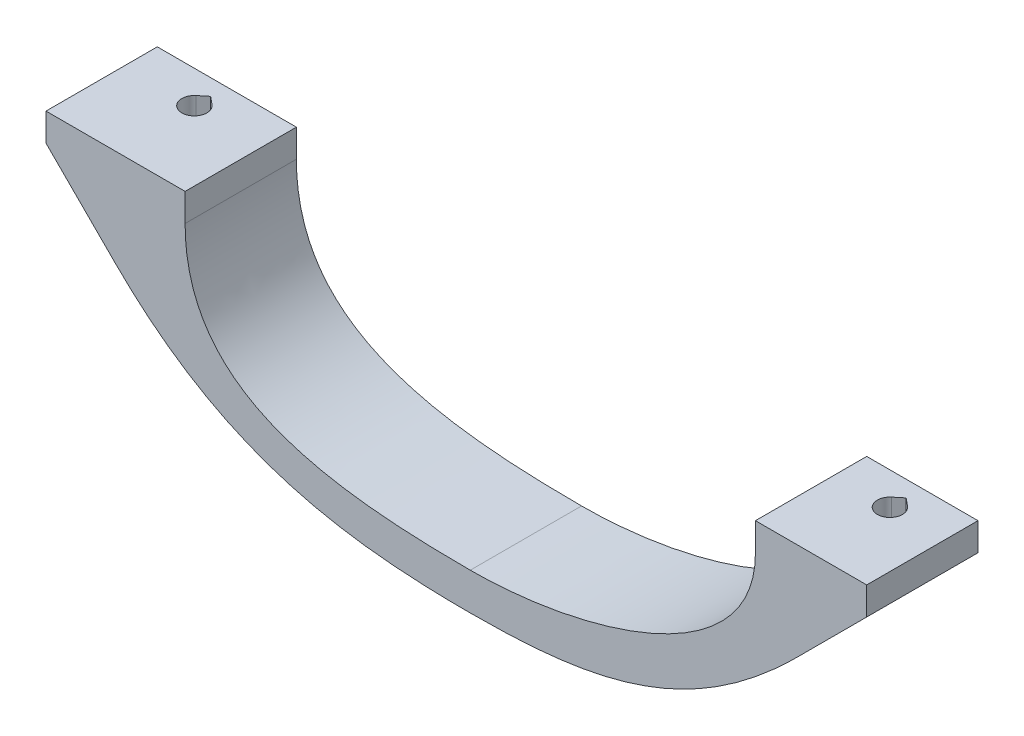
ISO-10303-21;
HEADER;
FILE_DESCRIPTION(('STEP AP214'),'2;1');
FILE_NAME('part.step','',(''),(''),'','','');
FILE_SCHEMA(('AUTOMOTIVE_DESIGN { 1 0 10303 214 1 1 1 1 }'));
ENDSEC;
DATA;
#1=APPLICATION_CONTEXT('core data for automotive mechanical design processes');
#2=APPLICATION_PROTOCOL_DEFINITION('international standard','automotive_design',2000,#1);
#3=PRODUCT_CONTEXT('',#1,'mechanical');
#4=PRODUCT('Part','Part','',(#3));
#5=PRODUCT_RELATED_PRODUCT_CATEGORY('part','',(#4));
#6=PRODUCT_DEFINITION_FORMATION('','',#4);
#7=PRODUCT_DEFINITION_CONTEXT('part definition',#1,'design');
#8=PRODUCT_DEFINITION('design','',#6,#7);
#9=PRODUCT_DEFINITION_SHAPE('','',#8);
#10=(LENGTH_UNIT() NAMED_UNIT(*) SI_UNIT(.MILLI.,.METRE.));
#11=(NAMED_UNIT(*) PLANE_ANGLE_UNIT() SI_UNIT($,.RADIAN.));
#12=(NAMED_UNIT(*) SI_UNIT($,.STERADIAN.) SOLID_ANGLE_UNIT());
#13=UNCERTAINTY_MEASURE_WITH_UNIT(LENGTH_MEASURE(1.E-05),#10,'distance_accuracy_value','');
#14=(GEOMETRIC_REPRESENTATION_CONTEXT(3) GLOBAL_UNCERTAINTY_ASSIGNED_CONTEXT((#13)) GLOBAL_UNIT_ASSIGNED_CONTEXT((#10,
#11,#12)) REPRESENTATION_CONTEXT('',''));
#15=CARTESIAN_POINT('',(0.,0.,0.));
#16=DIRECTION('',(0.,0.,1.));
#17=DIRECTION('',(1.,0.,0.));
#18=AXIS2_PLACEMENT_3D('',#15,#16,#17);
#19=CARTESIAN_POINT('',(82.5,-63.9999999999999,-8.5));
#20=DIRECTION('',(0.,1.,0.));
#21=DIRECTION('',(0.,0.,1.));
#22=AXIS2_PLACEMENT_3D('',#19,#20,#21);
#23=CYLINDRICAL_SURFACE('',#22,1.35000000000001);
#24=DIRECTION('',(0.,1.,0.));
#25=VECTOR('',#24,1.);
#26=CARTESIAN_POINT('',(81.6409734983062,-63.9999999999999,-9.54142857142858));
#27=LINE('',#26,#25);
#28=CARTESIAN_POINT('',(81.6409734983062,-43.,-9.54142857142858));
#29=VERTEX_POINT('',#28);
#30=CARTESIAN_POINT('',(81.6409734983062,-40.,-9.54142857142858));
#31=VERTEX_POINT('',#30);
#32=EDGE_CURVE('E182',#29,#31,#27,.T.);
#33=ORIENTED_EDGE('',*,*,#32,.T.);
#34=CARTESIAN_POINT('',(82.5,-40.,-8.5));
#35=DIRECTION('',(0.,1.,0.));
#36=DIRECTION('',(0.,0.,1.));
#37=AXIS2_PLACEMENT_3D('',#34,#35,#36);
#38=CIRCLE('',#37,1.35000000000001);
#39=CARTESIAN_POINT('',(83.3590265016938,-40.,-9.54142857142858));
#40=VERTEX_POINT('',#39);
#41=EDGE_CURVE('E192',#31,#40,#38,.T.);
#42=ORIENTED_EDGE('',*,*,#41,.T.);
#43=DIRECTION('',(0.,1.,0.));
#44=VECTOR('',#43,1.);
#45=CARTESIAN_POINT('',(83.3590265016938,-63.9999999999999,-9.54142857142858));
#46=LINE('',#45,#44);
#47=CARTESIAN_POINT('',(83.3590265016938,-43.,-9.54142857142858));
#48=VERTEX_POINT('',#47);
#49=EDGE_CURVE('E195',#48,#40,#46,.T.);
#50=ORIENTED_EDGE('',*,*,#49,.F.);
#51=CARTESIAN_POINT('',(82.5,-43.,-8.5));
#52=DIRECTION('',(0.,1.,0.));
#53=DIRECTION('',(0.,0.,1.));
#54=AXIS2_PLACEMENT_3D('',#51,#52,#53);
#55=CIRCLE('',#54,1.35000000000001);
#56=EDGE_CURVE('E194',#48,#29,#55,.F.);
#57=ORIENTED_EDGE('',*,*,#56,.T.);
#58=EDGE_LOOP('',(#33,#42,#50,#57));
#59=FACE_BOUND('',#58,.T.);
#60=ADVANCED_FACE('F43',(#59),#23,.F.);
#61=CARTESIAN_POINT('',(7.5,-63.9999999999999,-8.5));
#62=DIRECTION('',(0.,1.,0.));
#63=DIRECTION('',(0.,0.,1.));
#64=AXIS2_PLACEMENT_3D('',#61,#62,#63);
#65=CYLINDRICAL_SURFACE('',#64,1.35);
#66=DIRECTION('',(0.,1.,0.));
#67=VECTOR('',#66,1.);
#68=CARTESIAN_POINT('',(6.64097349830623,-63.9999999999999,-9.54142857142858));
#69=LINE('',#68,#67);
#70=CARTESIAN_POINT('',(6.64097349830623,-43.,-9.54142857142858));
#71=VERTEX_POINT('',#70);
#72=CARTESIAN_POINT('',(6.64097349830623,-40.,-9.54142857142858));
#73=VERTEX_POINT('',#72);
#74=EDGE_CURVE('E431',#71,#73,#69,.T.);
#75=ORIENTED_EDGE('',*,*,#74,.T.);
#76=CARTESIAN_POINT('',(7.5,-40.,-8.5));
#77=DIRECTION('',(0.,1.,0.));
#78=DIRECTION('',(0.,0.,1.));
#79=AXIS2_PLACEMENT_3D('',#76,#77,#78);
#80=CIRCLE('',#79,1.35);
#81=CARTESIAN_POINT('',(8.35902650169377,-40.,-9.54142857142857));
#82=VERTEX_POINT('',#81);
#83=EDGE_CURVE('E199',#73,#82,#80,.T.);
#84=ORIENTED_EDGE('',*,*,#83,.T.);
#85=DIRECTION('',(0.,1.,0.));
#86=VECTOR('',#85,1.);
#87=CARTESIAN_POINT('',(8.35902650169377,-63.9999999999999,-9.54142857142857));
#88=LINE('',#87,#86);
#89=CARTESIAN_POINT('',(8.35902650169377,-43.,-9.54142857142857));
#90=VERTEX_POINT('',#89);
#91=EDGE_CURVE('E427',#90,#82,#88,.T.);
#92=ORIENTED_EDGE('',*,*,#91,.F.);
#93=CARTESIAN_POINT('',(7.5,-43.,-8.5));
#94=DIRECTION('',(0.,1.,0.));
#95=DIRECTION('',(0.,0.,1.));
#96=AXIS2_PLACEMENT_3D('',#93,#94,#95);
#97=CIRCLE('',#96,1.35);
#98=EDGE_CURVE('E384',#90,#71,#97,.F.);
#99=ORIENTED_EDGE('',*,*,#98,.T.);
#100=EDGE_LOOP('',(#75,#84,#92,#99));
#101=FACE_BOUND('',#100,.T.);
#102=ADVANCED_FACE('F254',(#101),#65,.F.);
#103=CARTESIAN_POINT('',(45.75,-63.9999999999999,-12.));
#104=CARTESIAN_POINT('',(59.0199011969863,-63.9999999999999,-12.));
#105=CARTESIAN_POINT('',(69.4421031795114,-62.0578968204887,-12.));
#106=CARTESIAN_POINT('',(81.,-50.5,-12.));
#107=B_SPLINE_CURVE_WITH_KNOTS('',3,(#103,#104,#105,#106),.UNSPECIFIED.,.F.,.F.,(4,4),(0.,1.),.UNSPECIFIED.);
#108=DIRECTION('',(0.,0.,1.));
#109=VECTOR('',#108,1.);
#110=SURFACE_OF_LINEAR_EXTRUSION('',#107,#109);
#111=DIRECTION('',(0.,0.,1.));
#112=VECTOR('',#111,1.);
#113=CARTESIAN_POINT('',(81.,-50.5,-12.));
#114=LINE('',#113,#112);
#115=CARTESIAN_POINT('',(81.,-50.5,-12.));
#116=VERTEX_POINT('',#115);
#117=CARTESIAN_POINT('',(81.,-50.5,-10.5));
#118=VERTEX_POINT('',#117);
#119=EDGE_CURVE('E359',#116,#118,#114,.T.);
#120=ORIENTED_EDGE('',*,*,#119,.T.);
#121=CARTESIAN_POINT('',(81.,-50.5,-10.5));
#122=CARTESIAN_POINT('',(80.8978799533085,-50.602154744411,-10.4234048646829));
#123=CARTESIAN_POINT('',(80.798532407103,-50.7008050674264,-10.3366462427261));
#124=CARTESIAN_POINT('',(80.6093479466781,-50.8876034704642,-10.1413817827994));
#125=CARTESIAN_POINT('',(80.5196117209184,-50.9756413870717,-10.0326747619081));
#126=CARTESIAN_POINT('',(80.3759505373498,-51.1158846787573,-9.82299975213102));
#127=CARTESIAN_POINT('',(80.3186493345569,-51.1715745989149,-9.72672206239361));
#128=CARTESIAN_POINT('',(80.2158859772383,-51.2711458708271,-9.52263907355065));
#129=CARTESIAN_POINT('',(80.1703878151848,-51.3150631513613,-9.41487028445873));
#130=CARTESIAN_POINT('',(80.1129581158789,-51.370380549298,-9.24542675939085));
#131=CARTESIAN_POINT('',(80.0955476556023,-51.3871269386674,-9.18727996549064));
#132=CARTESIAN_POINT('',(80.0648337523512,-51.4166431510372,-9.06894130926905));
#133=CARTESIAN_POINT('',(80.0515280856971,-51.4294151271193,-9.00875057389531));
#134=CARTESIAN_POINT('',(80.0293300673866,-51.4507101530765,-8.88681823421578));
#135=CARTESIAN_POINT('',(80.0204375290833,-51.4592333826462,-8.825076695615));
#136=CARTESIAN_POINT('',(80.0072810780956,-51.471839632867,-8.70067776034953));
#137=CARTESIAN_POINT('',(80.0030163456924,-51.4759234398688,-8.63802052787412));
#138=CARTESIAN_POINT('',(79.9979295899958,-51.4807954608365,-8.46850397681319));
#139=CARTESIAN_POINT('',(80.0015889132169,-51.4772931858934,-8.36132094712269));
#140=CARTESIAN_POINT('',(80.0223885156301,-51.4573644393085,-8.14959893440992));
#141=CARTESIAN_POINT('',(80.0395264245296,-51.4409402400669,-8.04505948983282));
#142=CARTESIAN_POINT('',(80.0852222355038,-51.3970596661661,-7.84501372893859));
#143=CARTESIAN_POINT('',(80.1133576835453,-51.3700112365557,-7.74931907675146));
#144=CARTESIAN_POINT('',(80.1794315384967,-51.3063281124676,-7.56480824031657));
#145=CARTESIAN_POINT('',(80.2173730599392,-51.2696903722569,-7.47599425312471));
#146=CARTESIAN_POINT('',(80.3184245823851,-51.1718098872717,-7.27181373568218));
#147=CARTESIAN_POINT('',(80.3854994327815,-51.1066162044042,-7.16030196521182));
#148=CARTESIAN_POINT('',(80.531411219059,-50.9640524550705,-6.95380446864902));
#149=CARTESIAN_POINT('',(80.6102775690707,-50.8866519110895,-6.85886139500016));
#150=CARTESIAN_POINT('',(80.7420191900938,-50.7566227977047,-6.72109637914178));
#151=CARTESIAN_POINT('',(80.7922597065752,-50.7068824274382,-6.67288713108134));
#152=CARTESIAN_POINT('',(80.8947149797709,-50.6051059543629,-6.58226793205849));
#153=CARTESIAN_POINT('',(80.9469155033842,-50.553086066152,-6.53982375540152));
#154=CARTESIAN_POINT('',(81.,-50.5,-6.50000000000001));
#155=B_SPLINE_CURVE_WITH_KNOTS('',3,(#121,#122,#123,#124,#125,#126,#127,#128,#129,#130,#131,
#132,#133,#134,#135,#136,#137,#138,#139,#140,#141,#142,#143,#144,#145,#146,#147,#148,#149,#150,
#151,#152,#153,#154),.UNSPECIFIED.,.F.,.F.,(4,2,2,2,2,2,2,2,2,2,2,2,2,2,2,2,4),(0.,
0.491474026861417,0.98767612511601,1.36164356955517,1.7344563667553,1.9231061864695,
2.11165362919935,2.30019309691203,2.48869916336274,2.8087933147325,3.12883118814948,
3.43762310188214,3.74651321260427,4.18078117785821,4.61615108771081,4.87264109239589,
5.12753478184145),.UNSPECIFIED.);
#156=CARTESIAN_POINT('',(81.,-50.5,-6.50000000000001));
#157=VERTEX_POINT('',#156);
#158=EDGE_CURVE('E390',#118,#157,#155,.T.);
#159=ORIENTED_EDGE('',*,*,#158,.T.);
#160=CARTESIAN_POINT('',(81.,-50.5,0.));
#161=VERTEX_POINT('',#160);
#162=EDGE_CURVE('E362',#157,#161,#114,.T.);
#163=ORIENTED_EDGE('',*,*,#162,.T.);
#164=CARTESIAN_POINT('',(45.75,-63.9999999999999,0.));
#165=CARTESIAN_POINT('',(59.0199011969863,-63.9999999999999,0.));
#166=CARTESIAN_POINT('',(69.4421031795114,-62.0578968204887,0.));
#167=CARTESIAN_POINT('',(81.,-50.5,0.));
#168=B_SPLINE_CURVE_WITH_KNOTS('',3,(#164,#165,#166,#167),.UNSPECIFIED.,.F.,.F.,(4,4),(0.,1.),.UNSPECIFIED.);
#169=CARTESIAN_POINT('',(45.75,-63.9999999999999,0.));
#170=VERTEX_POINT('',#169);
#171=EDGE_CURVE('E343',#170,#161,#168,.T.);
#172=ORIENTED_EDGE('',*,*,#171,.F.);
#173=DIRECTION('',(0.,0.,1.));
#174=VECTOR('',#173,1.);
#175=CARTESIAN_POINT('',(45.75,-63.9999999999999,-12.));
#176=LINE('',#175,#174);
#177=CARTESIAN_POINT('',(45.75,-63.9999999999999,-12.));
#178=VERTEX_POINT('',#177);
#179=EDGE_CURVE('E363',#178,#170,#176,.T.);
#180=ORIENTED_EDGE('',*,*,#179,.F.);
#181=EDGE_CURVE('E284',#178,#116,#107,.T.);
#182=ORIENTED_EDGE('',*,*,#181,.T.);
#183=EDGE_LOOP('',(#120,#159,#163,#172,#180,#182));
#184=FACE_BOUND('',#183,.T.);
#185=ADVANCED_FACE('F260',(#184),#110,.T.);
#186=CARTESIAN_POINT('',(7.5,-50.4999999999999,-12.));
#187=CARTESIAN_POINT('',(19.0731812469173,-62.073181246917,-12.));
#188=CARTESIAN_POINT('',(31.7289344991981,-63.9999999999999,-12.));
#189=CARTESIAN_POINT('',(45.75,-63.9999999999999,-12.));
#190=B_SPLINE_CURVE_WITH_KNOTS('',3,(#186,#187,#188,#189),.UNSPECIFIED.,.F.,.F.,(4,4),(0.,1.),.UNSPECIFIED.);
#191=DIRECTION('',(0.,0.,1.));
#192=VECTOR('',#191,1.);
#193=SURFACE_OF_LINEAR_EXTRUSION('',#190,#192);
#194=DIRECTION('',(0.,0.,1.));
#195=VECTOR('',#194,1.);
#196=CARTESIAN_POINT('',(7.5,-50.4999999999999,-12.));
#197=LINE('',#196,#195);
#198=CARTESIAN_POINT('',(7.5,-50.4999999999999,-6.));
#199=VERTEX_POINT('',#198);
#200=CARTESIAN_POINT('',(7.5,-50.4999999999999,0.));
#201=VERTEX_POINT('',#200);
#202=EDGE_CURVE('E368',#199,#201,#197,.T.);
#203=ORIENTED_EDGE('',*,*,#202,.F.);
#204=CARTESIAN_POINT('',(7.5,-50.4999999999999,-6.));
#205=CARTESIAN_POINT('',(7.59202458361,-50.5920313219231,-6.00002218462616));
#206=CARTESIAN_POINT('',(7.68441911287659,-50.6837408818792,-6.00508367174386));
#207=CARTESIAN_POINT('',(7.86944957853199,-50.8660458805666,-6.02568805679928));
#208=CARTESIAN_POINT('',(7.96208565508687,-50.9566391004135,-6.04124919643966));
#209=CARTESIAN_POINT('',(8.14770775603044,-51.1368207073336,-6.08347037070071));
#210=CARTESIAN_POINT('',(8.24068787286012,-51.22638971867,-6.11024086164086));
#211=CARTESIAN_POINT('',(8.42508927550051,-51.4027117137785,-6.17539953246385));
#212=CARTESIAN_POINT('',(8.51651175271218,-51.4894669003341,-6.21377836927347));
#213=CARTESIAN_POINT('',(8.73076418009163,-51.6913056075002,-6.31954656331152));
#214=CARTESIAN_POINT('',(8.85248238259891,-51.8047794211707,-6.39241801336778));
#215=CARTESIAN_POINT('',(9.08694581756101,-52.0213194616817,-6.56286168266067));
#216=CARTESIAN_POINT('',(9.19972211828598,-52.1244220916136,-6.6603429651215));
#217=CARTESIAN_POINT('',(9.38819086542387,-52.2953049074502,-6.85712963054418));
#218=CARTESIAN_POINT('',(9.46660176235044,-52.3658805543693,-6.95138182618938));
#219=CARTESIAN_POINT('',(9.61152992564585,-52.4955981526102,-7.15572308259922));
#220=CARTESIAN_POINT('',(9.67805697565096,-52.554749512514,-7.26579898014069));
#221=CARTESIAN_POINT('',(9.78504966032763,-52.6494706197074,-7.48005055612948));
#222=CARTESIAN_POINT('',(9.82803412395988,-52.6873509694143,-7.58193869411241));
#223=CARTESIAN_POINT('',(9.90080718606569,-52.7513203843171,-7.79385076122563));
#224=CARTESIAN_POINT('',(9.9306033109641,-52.7774161749906,-7.90387000808402));
#225=CARTESIAN_POINT('',(9.97513744033178,-52.8163707843204,-8.12984435449813));
#226=CARTESIAN_POINT('',(9.98979733423343,-52.8291609417525,-8.24582703409824));
#227=CARTESIAN_POINT('',(10.002646316179,-52.8403730329712,-8.47938867719886));
#228=CARTESIAN_POINT('',(10.0008401428213,-52.8387991004497,-8.59696717173118));
#229=CARTESIAN_POINT('',(9.98179574857887,-52.8221756698972,-8.81949198828807));
#230=CARTESIAN_POINT('',(9.96591048249544,-52.8083075739352,-8.92464899489287));
#231=CARTESIAN_POINT('',(9.92156955276858,-52.769502732464,-9.13012060341623));
#232=CARTESIAN_POINT('',(9.89311302477881,-52.7445652258687,-9.2304348718426));
#233=CARTESIAN_POINT('',(9.82393993327737,-52.6837422260228,-9.42770453956131));
#234=CARTESIAN_POINT('',(9.78280799786503,-52.6474851624174,-9.52439757850327));
#235=CARTESIAN_POINT('',(9.69073215488594,-52.5659718056744,-9.70885980114546));
#236=CARTESIAN_POINT('',(9.639782974982,-52.5207106764907,-9.79662415083185));
#237=CARTESIAN_POINT('',(9.50549519568935,-52.4008187949479,-9.99955725921368));
#238=CARTESIAN_POINT('',(9.41784972250228,-52.3220958931799,-10.1094742949846));
#239=CARTESIAN_POINT('',(9.23117583801767,-52.1530228059143,-10.3088019881589));
#240=CARTESIAN_POINT('',(9.13212444586179,-52.0626491007917,-10.3981701186301));
#241=CARTESIAN_POINT('',(8.89187877865117,-51.8414850017041,-10.5839559155556));
#242=CARTESIAN_POINT('',(8.74774593650178,-51.7073498402055,-10.6725687225006));
#243=CARTESIAN_POINT('',(8.45268853763737,-51.4292929085556,-10.81720725006));
#244=CARTESIAN_POINT('',(8.30175302447321,-51.2853551447969,-10.8731782183824));
#245=CARTESIAN_POINT('',(8.04151415317256,-51.0340415507112,-10.9432198151391));
#246=CARTESIAN_POINT('',(7.93274587827514,-50.9280807424228,-10.9647165524253));
#247=CARTESIAN_POINT('',(7.71581919666631,-50.7148904687216,-10.993041458396));
#248=CARTESIAN_POINT('',(7.60766105011408,-50.607672443387,-10.9999569414402));
#249=CARTESIAN_POINT('',(7.5,-50.4999999999999,-11.));
#250=B_SPLINE_CURVE_WITH_KNOTS('',3,(#204,#205,#206,#207,#208,#209,#210,#211,#212,#213,#214,
#215,#216,#217,#218,#219,#220,#221,#222,#223,#224,#225,#226,#227,#228,#229,#230,#231,#232,#233,
#234,#235,#236,#237,#238,#239,#240,#241,#242,#243,#244,#245,#246,#247,#248,#249),.UNSPECIFIED.,
.F.,.F.,(4,2,2,2,2,2,2,2,2,2,2,2,2,2,2,2,2,2,2,2,2,2,4),(0.,0.390393734827477,0.781467477503607,
1.17648906592481,1.57119356017284,2.11426479469427,2.65535794863997,3.078214385065,
3.5007210749581,3.84995299924722,4.19898536333421,4.54981004151233,4.90053376269014,
5.22081811891119,5.54112449994627,5.87330454117321,6.20566347895936,6.68636128150267,
7.16804513224342,7.81233786743227,8.45770823154504,8.91712723193044,9.3737872688862),.UNSPECIFIED.);
#251=CARTESIAN_POINT('',(7.5,-50.4999999999999,-11.));
#252=VERTEX_POINT('',#251);
#253=EDGE_CURVE('E206',#199,#252,#250,.T.);
#254=ORIENTED_EDGE('',*,*,#253,.T.);
#255=CARTESIAN_POINT('',(7.5,-50.4999999999999,-12.));
#256=VERTEX_POINT('',#255);
#257=EDGE_CURVE('E365',#256,#252,#197,.T.);
#258=ORIENTED_EDGE('',*,*,#257,.F.);
#259=EDGE_CURVE('E291',#256,#178,#190,.T.);
#260=ORIENTED_EDGE('',*,*,#259,.T.);
#261=ORIENTED_EDGE('',*,*,#179,.T.);
#262=CARTESIAN_POINT('',(7.5,-50.4999999999999,0.));
#263=CARTESIAN_POINT('',(19.0731812469173,-62.073181246917,0.));
#264=CARTESIAN_POINT('',(31.7289344991981,-63.9999999999999,0.));
#265=CARTESIAN_POINT('',(45.75,-63.9999999999999,0.));
#266=B_SPLINE_CURVE_WITH_KNOTS('',3,(#262,#263,#264,#265),.UNSPECIFIED.,.F.,.F.,(4,4),(0.,1.),.UNSPECIFIED.);
#267=EDGE_CURVE('E338',#201,#170,#266,.T.);
#268=ORIENTED_EDGE('',*,*,#267,.F.);
#269=EDGE_LOOP('',(#203,#254,#258,#260,#261,#268));
#270=FACE_BOUND('',#269,.T.);
#271=ADVANCED_FACE('F278',(#270),#193,.T.);
#272=CARTESIAN_POINT('',(88.5,-40.,-12.));
#273=DIRECTION('',(1.,0.,0.));
#274=DIRECTION('',(0.,0.,-1.));
#275=AXIS2_PLACEMENT_3D('',#272,#273,#274);
#276=PLANE('',#275);
#277=DIRECTION('',(0.,1.,0.));
#278=VECTOR('',#277,1.);
#279=CARTESIAN_POINT('',(88.5,-40.,0.));
#280=LINE('',#279,#278);
#281=CARTESIAN_POINT('',(88.5,-43.,0.));
#282=VERTEX_POINT('',#281);
#283=CARTESIAN_POINT('',(88.5,-40.,0.));
#284=VERTEX_POINT('',#283);
#285=EDGE_CURVE('E203',#282,#284,#280,.T.);
#286=ORIENTED_EDGE('',*,*,#285,.F.);
#287=DIRECTION('',(0.,0.,1.));
#288=VECTOR('',#287,1.);
#289=CARTESIAN_POINT('',(88.5,-43.,-12.));
#290=LINE('',#289,#288);
#291=CARTESIAN_POINT('',(88.5,-43.,-12.));
#292=VERTEX_POINT('',#291);
#293=EDGE_CURVE('E356',#292,#282,#290,.T.);
#294=ORIENTED_EDGE('',*,*,#293,.F.);
#295=DIRECTION('',(0.,1.,0.));
#296=VECTOR('',#295,1.);
#297=CARTESIAN_POINT('',(88.5,-40.,-12.));
#298=LINE('',#297,#296);
#299=CARTESIAN_POINT('',(88.5,-40.,-12.));
#300=VERTEX_POINT('',#299);
#301=EDGE_CURVE('E209',#292,#300,#298,.T.);
#302=ORIENTED_EDGE('',*,*,#301,.T.);
#303=DIRECTION('',(0.,0.,1.));
#304=VECTOR('',#303,1.);
#305=CARTESIAN_POINT('',(88.5,-40.,-12.));
#306=LINE('',#305,#304);
#307=EDGE_CURVE('E301',#300,#284,#306,.T.);
#308=ORIENTED_EDGE('',*,*,#307,.T.);
#309=EDGE_LOOP('',(#286,#294,#302,#308));
#310=FACE_BOUND('',#309,.T.);
#311=ADVANCED_FACE('F45',(#310),#276,.T.);
#312=CARTESIAN_POINT('',(88.5,-43.,-12.));
#313=DIRECTION('',(0.70710678118655,-0.707106781186546,0.));
#314=DIRECTION('',(0.707106781186546,0.70710678118655,0.));
#315=AXIS2_PLACEMENT_3D('',#312,#313,#314);
#316=PLANE('',#315);
#317=ORIENTED_EDGE('',*,*,#162,.F.);
#318=CARTESIAN_POINT('',(82.5,-49.,-8.5));
#319=DIRECTION('',(0.70710678118655,-0.707106781186546,0.));
#320=DIRECTION('',(-0.707106781186546,-0.70710678118655,0.));
#321=AXIS2_PLACEMENT_3D('',#318,#319,#320);
#322=ELLIPSE('',#321,3.53553390593274,2.5);
#323=EDGE_CURVE('E200',#157,#118,#322,.F.);
#324=ORIENTED_EDGE('',*,*,#323,.T.);
#325=ORIENTED_EDGE('',*,*,#119,.F.);
#326=DIRECTION('',(0.707106781186545,0.707106781186549,0.));
#327=VECTOR('',#326,1.);
#328=CARTESIAN_POINT('',(88.5,-43.,-12.));
#329=LINE('',#328,#327);
#330=EDGE_CURVE('E290',#116,#292,#329,.T.);
#331=ORIENTED_EDGE('',*,*,#330,.T.);
#332=ORIENTED_EDGE('',*,*,#293,.T.);
#333=DIRECTION('',(0.707106781186545,0.707106781186549,0.));
#334=VECTOR('',#333,1.);
#335=CARTESIAN_POINT('',(88.5,-43.,0.));
#336=LINE('',#335,#334);
#337=EDGE_CURVE('E213',#161,#282,#336,.T.);
#338=ORIENTED_EDGE('',*,*,#337,.F.);
#339=EDGE_LOOP('',(#317,#324,#325,#331,#332,#338));
#340=FACE_BOUND('',#339,.T.);
#341=ADVANCED_FACE('F269',(#340),#316,.T.);
#342=CARTESIAN_POINT('',(0.,-43.,-12.));
#343=DIRECTION('',(-0.707106781186544,-0.707106781186551,0.));
#344=DIRECTION('',(0.707106781186551,-0.707106781186544,0.));
#345=AXIS2_PLACEMENT_3D('',#342,#343,#344);
#346=PLANE('',#345);
#347=ORIENTED_EDGE('',*,*,#257,.T.);
#348=CARTESIAN_POINT('',(7.5,-50.4999999999999,-8.5));
#349=DIRECTION('',(-0.707106781186544,-0.707106781186551,0.));
#350=DIRECTION('',(0.707106781186551,-0.707106781186544,0.));
#351=AXIS2_PLACEMENT_3D('',#348,#349,#350);
#352=ELLIPSE('',#351,3.53553390593272,2.5);
#353=EDGE_CURVE('E358',#252,#199,#352,.F.);
#354=ORIENTED_EDGE('',*,*,#353,.T.);
#355=ORIENTED_EDGE('',*,*,#202,.T.);
#356=DIRECTION('',(0.707106781186551,-0.707106781186544,0.));
#357=VECTOR('',#356,1.);
#358=CARTESIAN_POINT('',(0.,-43.,0.));
#359=LINE('',#358,#357);
#360=CARTESIAN_POINT('',(0.,-43.,0.));
#361=VERTEX_POINT('',#360);
#362=EDGE_CURVE('E335',#361,#201,#359,.T.);
#363=ORIENTED_EDGE('',*,*,#362,.F.);
#364=DIRECTION('',(0.,0.,1.));
#365=VECTOR('',#364,1.);
#366=CARTESIAN_POINT('',(0.,-43.,-12.));
#367=LINE('',#366,#365);
#368=CARTESIAN_POINT('',(0.,-43.,-12.));
#369=VERTEX_POINT('',#368);
#370=EDGE_CURVE('E369',#369,#361,#367,.T.);
#371=ORIENTED_EDGE('',*,*,#370,.F.);
#372=DIRECTION('',(0.707106781186551,-0.707106781186544,0.));
#373=VECTOR('',#372,1.);
#374=CARTESIAN_POINT('',(0.,-43.,-12.));
#375=LINE('',#374,#373);
#376=EDGE_CURVE('E487',#369,#256,#375,.T.);
#377=ORIENTED_EDGE('',*,*,#376,.T.);
#378=EDGE_LOOP('',(#347,#354,#355,#363,#371,#377));
#379=FACE_BOUND('',#378,.T.);
#380=ADVANCED_FACE('F272',(#379),#346,.T.);
#381=CARTESIAN_POINT('',(0.,-40.,-12.));
#382=DIRECTION('',(-1.,0.,0.));
#383=DIRECTION('',(0.,-1.,0.));
#384=AXIS2_PLACEMENT_3D('',#381,#382,#383);
#385=PLANE('',#384);
#386=DIRECTION('',(0.,-1.,0.));
#387=VECTOR('',#386,1.);
#388=CARTESIAN_POINT('',(0.,-40.,0.));
#389=LINE('',#388,#387);
#390=CARTESIAN_POINT('',(0.,-40.,0.));
#391=VERTEX_POINT('',#390);
#392=EDGE_CURVE('E332',#391,#361,#389,.T.);
#393=ORIENTED_EDGE('',*,*,#392,.F.);
#394=DIRECTION('',(0.,0.,1.));
#395=VECTOR('',#394,1.);
#396=CARTESIAN_POINT('',(0.,-40.,-12.));
#397=LINE('',#396,#395);
#398=CARTESIAN_POINT('',(0.,-40.,-12.));
#399=VERTEX_POINT('',#398);
#400=EDGE_CURVE('E371',#399,#391,#397,.T.);
#401=ORIENTED_EDGE('',*,*,#400,.F.);
#402=DIRECTION('',(0.,-1.,0.));
#403=VECTOR('',#402,1.);
#404=CARTESIAN_POINT('',(0.,-40.,-12.));
#405=LINE('',#404,#403);
#406=EDGE_CURVE('E483',#399,#369,#405,.T.);
#407=ORIENTED_EDGE('',*,*,#406,.T.);
#408=ORIENTED_EDGE('',*,*,#370,.T.);
#409=EDGE_LOOP('',(#393,#401,#407,#408));
#410=FACE_BOUND('',#409,.T.);
#411=ADVANCED_FACE('F468',(#410),#385,.T.);
#412=CARTESIAN_POINT('',(15.,-40.,-12.));
#413=DIRECTION('',(0.,1.,0.));
#414=DIRECTION('',(0.,0.,1.));
#415=AXIS2_PLACEMENT_3D('',#412,#413,#414);
#416=PLANE('',#415);
#417=DIRECTION('',(-0.771428571428573,0.,0.636315927180573));
#418=VECTOR('',#417,1.);
#419=CARTESIAN_POINT('',(7.5,-40.,-10.25));
#420=LINE('',#419,#418);
#421=CARTESIAN_POINT('',(7.5,-40.,-10.25));
#422=VERTEX_POINT('',#421);
#423=EDGE_CURVE('E458',#422,#73,#420,.T.);
#424=ORIENTED_EDGE('',*,*,#423,.F.);
#425=DIRECTION('',(-0.771428571428571,0.,-0.636315927180574));
#426=VECTOR('',#425,1.);
#427=CARTESIAN_POINT('',(7.5,-40.,-10.25));
#428=LINE('',#427,#426);
#429=EDGE_CURVE('E434',#82,#422,#428,.T.);
#430=ORIENTED_EDGE('',*,*,#429,.F.);
#431=ORIENTED_EDGE('',*,*,#83,.F.);
#432=EDGE_LOOP('',(#424,#430,#431));
#433=FACE_BOUND('',#432,.T.);
#434=DIRECTION('',(-1.,0.,0.));
#435=VECTOR('',#434,1.);
#436=CARTESIAN_POINT('',(15.,-40.,0.));
#437=LINE('',#436,#435);
#438=CARTESIAN_POINT('',(15.,-40.,0.));
#439=VERTEX_POINT('',#438);
#440=EDGE_CURVE('E329',#439,#391,#437,.T.);
#441=ORIENTED_EDGE('',*,*,#440,.F.);
#442=DIRECTION('',(0.,0.,1.));
#443=VECTOR('',#442,1.);
#444=CARTESIAN_POINT('',(15.,-40.,-12.));
#445=LINE('',#444,#443);
#446=CARTESIAN_POINT('',(15.,-40.,-12.));
#447=VERTEX_POINT('',#446);
#448=EDGE_CURVE('E373',#447,#439,#445,.T.);
#449=ORIENTED_EDGE('',*,*,#448,.F.);
#450=DIRECTION('',(-1.,0.,0.));
#451=VECTOR('',#450,1.);
#452=CARTESIAN_POINT('',(15.,-40.,-12.));
#453=LINE('',#452,#451);
#454=EDGE_CURVE('E482',#447,#399,#453,.T.);
#455=ORIENTED_EDGE('',*,*,#454,.T.);
#456=ORIENTED_EDGE('',*,*,#400,.T.);
#457=EDGE_LOOP('',(#441,#449,#455,#456));
#458=FACE_BOUND('',#457,.T.);
#459=ADVANCED_FACE('F464',(#433,#458),#416,.T.);
#460=CARTESIAN_POINT('',(15.,-40.,-12.));
#461=DIRECTION('',(1.,0.,0.));
#462=DIRECTION('',(0.,0.,-1.));
#463=AXIS2_PLACEMENT_3D('',#460,#461,#462);
#464=PLANE('',#463);
#465=DIRECTION('',(0.,1.,0.));
#466=VECTOR('',#465,1.);
#467=CARTESIAN_POINT('',(15.,-40.,0.));
#468=LINE('',#467,#466);
#469=CARTESIAN_POINT('',(15.,-43.,0.));
#470=VERTEX_POINT('',#469);
#471=EDGE_CURVE('E323',#470,#439,#468,.T.);
#472=ORIENTED_EDGE('',*,*,#471,.F.);
#473=DIRECTION('',(0.,0.,1.));
#474=VECTOR('',#473,1.);
#475=CARTESIAN_POINT('',(15.,-43.,-12.));
#476=LINE('',#475,#474);
#477=CARTESIAN_POINT('',(15.,-43.,-12.));
#478=VERTEX_POINT('',#477);
#479=EDGE_CURVE('E375',#478,#470,#476,.T.);
#480=ORIENTED_EDGE('',*,*,#479,.F.);
#481=DIRECTION('',(0.,1.,0.));
#482=VECTOR('',#481,1.);
#483=CARTESIAN_POINT('',(15.,-40.,-12.));
#484=LINE('',#483,#482);
#485=EDGE_CURVE('E479',#478,#447,#484,.T.);
#486=ORIENTED_EDGE('',*,*,#485,.T.);
#487=ORIENTED_EDGE('',*,*,#448,.T.);
#488=EDGE_LOOP('',(#472,#480,#486,#487));
#489=FACE_BOUND('',#488,.T.);
#490=ADVANCED_FACE('F467',(#489),#464,.T.);
#491=CARTESIAN_POINT('',(45.7500000000001,-60.,-12.));
#492=CARTESIAN_POINT('',(29.6680228867207,-60.,-12.));
#493=CARTESIAN_POINT('',(15.,-57.8895101463763,-12.));
#494=CARTESIAN_POINT('',(15.,-43.,-12.));
#495=B_SPLINE_CURVE_WITH_KNOTS('',3,(#491,#492,#493,#494),.UNSPECIFIED.,.F.,.F.,(4,4),(0.,1.),.UNSPECIFIED.);
#496=DIRECTION('',(0.,0.,1.));
#497=VECTOR('',#496,1.);
#498=SURFACE_OF_LINEAR_EXTRUSION('',#495,#497);
#499=CARTESIAN_POINT('',(45.7500000000001,-60.,0.));
#500=CARTESIAN_POINT('',(29.6680228867207,-60.,0.));
#501=CARTESIAN_POINT('',(15.,-57.8895101463763,0.));
#502=CARTESIAN_POINT('',(15.,-43.,0.));
#503=B_SPLINE_CURVE_WITH_KNOTS('',3,(#499,#500,#501,#502),.UNSPECIFIED.,.F.,.F.,(4,4),(0.,1.),.UNSPECIFIED.);
#504=CARTESIAN_POINT('',(45.75,-60.,0.));
#505=VERTEX_POINT('',#504);
#506=EDGE_CURVE('E315',#505,#470,#503,.T.);
#507=ORIENTED_EDGE('',*,*,#506,.F.);
#508=DIRECTION('',(0.,0.,1.));
#509=VECTOR('',#508,1.);
#510=CARTESIAN_POINT('',(45.75,-60.,-12.));
#511=LINE('',#510,#509);
#512=CARTESIAN_POINT('',(45.75,-60.,-12.));
#513=VERTEX_POINT('',#512);
#514=EDGE_CURVE('E377',#513,#505,#511,.T.);
#515=ORIENTED_EDGE('',*,*,#514,.F.);
#516=EDGE_CURVE('E225',#513,#478,#495,.T.);
#517=ORIENTED_EDGE('',*,*,#516,.T.);
#518=ORIENTED_EDGE('',*,*,#479,.T.);
#519=EDGE_LOOP('',(#507,#515,#517,#518));
#520=FACE_BOUND('',#519,.T.);
#521=ADVANCED_FACE('F239',(#520),#498,.T.);
#522=CARTESIAN_POINT('',(76.5,-43.,-12.));
#523=CARTESIAN_POINT('',(76.5,-54.661574252392,-12.));
#524=CARTESIAN_POINT('',(58.3531852234972,-60.,-12.));
#525=CARTESIAN_POINT('',(45.75,-60.,-12.));
#526=B_SPLINE_CURVE_WITH_KNOTS('',3,(#522,#523,#524,#525),.UNSPECIFIED.,.F.,.F.,(4,4),(0.,1.),.UNSPECIFIED.);
#527=DIRECTION('',(0.,0.,1.));
#528=VECTOR('',#527,1.);
#529=SURFACE_OF_LINEAR_EXTRUSION('',#526,#528);
#530=CARTESIAN_POINT('',(76.5,-43.,0.));
#531=CARTESIAN_POINT('',(76.5,-54.661574252392,0.));
#532=CARTESIAN_POINT('',(58.3531852234972,-60.,0.));
#533=CARTESIAN_POINT('',(45.75,-60.,0.));
#534=B_SPLINE_CURVE_WITH_KNOTS('',3,(#530,#531,#532,#533),.UNSPECIFIED.,.F.,.F.,(4,4),(0.,1.),.UNSPECIFIED.);
#535=CARTESIAN_POINT('',(76.5,-43.,0.));
#536=VERTEX_POINT('',#535);
#537=EDGE_CURVE('E310',#536,#505,#534,.T.);
#538=ORIENTED_EDGE('',*,*,#537,.F.);
#539=DIRECTION('',(0.,0.,1.));
#540=VECTOR('',#539,1.);
#541=CARTESIAN_POINT('',(76.5,-43.,-12.));
#542=LINE('',#541,#540);
#543=CARTESIAN_POINT('',(76.5,-43.,-12.));
#544=VERTEX_POINT('',#543);
#545=EDGE_CURVE('E379',#544,#536,#542,.T.);
#546=ORIENTED_EDGE('',*,*,#545,.F.);
#547=EDGE_CURVE('E219',#544,#513,#526,.T.);
#548=ORIENTED_EDGE('',*,*,#547,.T.);
#549=ORIENTED_EDGE('',*,*,#514,.T.);
#550=EDGE_LOOP('',(#538,#546,#548,#549));
#551=FACE_BOUND('',#550,.T.);
#552=ADVANCED_FACE('F234',(#551),#529,.T.);
#553=CARTESIAN_POINT('',(76.5,-40.,-12.));
#554=DIRECTION('',(-1.,0.,0.));
#555=DIRECTION('',(0.,0.,1.));
#556=AXIS2_PLACEMENT_3D('',#553,#554,#555);
#557=PLANE('',#556);
#558=DIRECTION('',(0.,-1.,0.));
#559=VECTOR('',#558,1.);
#560=CARTESIAN_POINT('',(76.5,-40.,0.));
#561=LINE('',#560,#559);
#562=CARTESIAN_POINT('',(76.5,-40.,0.));
#563=VERTEX_POINT('',#562);
#564=EDGE_CURVE('E307',#563,#536,#561,.T.);
#565=ORIENTED_EDGE('',*,*,#564,.F.);
#566=DIRECTION('',(0.,0.,1.));
#567=VECTOR('',#566,1.);
#568=CARTESIAN_POINT('',(76.5,-40.,-12.));
#569=LINE('',#568,#567);
#570=CARTESIAN_POINT('',(76.5,-40.,-12.));
#571=VERTEX_POINT('',#570);
#572=EDGE_CURVE('E381',#571,#563,#569,.T.);
#573=ORIENTED_EDGE('',*,*,#572,.F.);
#574=DIRECTION('',(0.,-1.,0.));
#575=VECTOR('',#574,1.);
#576=CARTESIAN_POINT('',(76.5,-40.,-12.));
#577=LINE('',#576,#575);
#578=EDGE_CURVE('E216',#571,#544,#577,.T.);
#579=ORIENTED_EDGE('',*,*,#578,.T.);
#580=ORIENTED_EDGE('',*,*,#545,.T.);
#581=EDGE_LOOP('',(#565,#573,#579,#580));
#582=FACE_BOUND('',#581,.T.);
#583=ADVANCED_FACE('F238',(#582),#557,.T.);
#584=CARTESIAN_POINT('',(88.5,-40.,-12.));
#585=DIRECTION('',(0.,1.,0.));
#586=DIRECTION('',(0.,0.,1.));
#587=AXIS2_PLACEMENT_3D('',#584,#585,#586);
#588=PLANE('',#587);
#589=DIRECTION('',(-0.771428571428574,0.,0.63631592718057));
#590=VECTOR('',#589,1.);
#591=CARTESIAN_POINT('',(82.5,-40.,-10.25));
#592=LINE('',#591,#590);
#593=CARTESIAN_POINT('',(82.5,-40.,-10.25));
#594=VERTEX_POINT('',#593);
#595=EDGE_CURVE('E179',#594,#31,#592,.T.);
#596=ORIENTED_EDGE('',*,*,#595,.F.);
#597=DIRECTION('',(-0.771428571428574,0.,-0.63631592718057));
#598=VECTOR('',#597,1.);
#599=CARTESIAN_POINT('',(82.5,-40.,-10.25));
#600=LINE('',#599,#598);
#601=EDGE_CURVE('E186',#40,#594,#600,.T.);
#602=ORIENTED_EDGE('',*,*,#601,.F.);
#603=ORIENTED_EDGE('',*,*,#41,.F.);
#604=EDGE_LOOP('',(#596,#602,#603));
#605=FACE_BOUND('',#604,.T.);
#606=DIRECTION('',(-1.,0.,0.));
#607=VECTOR('',#606,1.);
#608=CARTESIAN_POINT('',(88.5,-40.,0.));
#609=LINE('',#608,#607);
#610=EDGE_CURVE('E304',#284,#563,#609,.T.);
#611=ORIENTED_EDGE('',*,*,#610,.F.);
#612=ORIENTED_EDGE('',*,*,#307,.F.);
#613=DIRECTION('',(-1.,0.,0.));
#614=VECTOR('',#613,1.);
#615=CARTESIAN_POINT('',(88.5,-40.,-12.));
#616=LINE('',#615,#614);
#617=EDGE_CURVE('E212',#300,#571,#616,.T.);
#618=ORIENTED_EDGE('',*,*,#617,.T.);
#619=ORIENTED_EDGE('',*,*,#572,.T.);
#620=EDGE_LOOP('',(#611,#612,#618,#619));
#621=FACE_BOUND('',#620,.T.);
#622=ADVANCED_FACE('F197',(#605,#621),#588,.T.);
#623=CARTESIAN_POINT('',(64.0170016411866,-61.5842113076832,-12.));
#624=DIRECTION('',(0.,0.,1.));
#625=DIRECTION('',(1.,0.,0.));
#626=AXIS2_PLACEMENT_3D('',#623,#624,#625);
#627=PLANE('',#626);
#628=ORIENTED_EDGE('',*,*,#301,.F.);
#629=ORIENTED_EDGE('',*,*,#330,.F.);
#630=ORIENTED_EDGE('',*,*,#181,.F.);
#631=ORIENTED_EDGE('',*,*,#259,.F.);
#632=ORIENTED_EDGE('',*,*,#376,.F.);
#633=ORIENTED_EDGE('',*,*,#406,.F.);
#634=ORIENTED_EDGE('',*,*,#454,.F.);
#635=ORIENTED_EDGE('',*,*,#485,.F.);
#636=ORIENTED_EDGE('',*,*,#516,.F.);
#637=ORIENTED_EDGE('',*,*,#547,.F.);
#638=ORIENTED_EDGE('',*,*,#578,.F.);
#639=ORIENTED_EDGE('',*,*,#617,.F.);
#640=EDGE_LOOP('',(#628,#629,#630,#631,#632,#633,#634,#635,#636,#637,#638,#639));
#641=FACE_BOUND('',#640,.T.);
#642=ADVANCED_FACE('F245',(#641),#627,.F.);
#643=CARTESIAN_POINT('',(64.0170016411866,-61.5842113076832,0.));
#644=DIRECTION('',(0.,0.,1.));
#645=DIRECTION('',(1.,0.,0.));
#646=AXIS2_PLACEMENT_3D('',#643,#644,#645);
#647=PLANE('',#646);
#648=ORIENTED_EDGE('',*,*,#285,.T.);
#649=ORIENTED_EDGE('',*,*,#610,.T.);
#650=ORIENTED_EDGE('',*,*,#564,.T.);
#651=ORIENTED_EDGE('',*,*,#537,.T.);
#652=ORIENTED_EDGE('',*,*,#506,.T.);
#653=ORIENTED_EDGE('',*,*,#471,.T.);
#654=ORIENTED_EDGE('',*,*,#440,.T.);
#655=ORIENTED_EDGE('',*,*,#392,.T.);
#656=ORIENTED_EDGE('',*,*,#362,.T.);
#657=ORIENTED_EDGE('',*,*,#267,.T.);
#658=ORIENTED_EDGE('',*,*,#171,.T.);
#659=ORIENTED_EDGE('',*,*,#337,.T.);
#660=EDGE_LOOP('',(#648,#649,#650,#651,#652,#653,#654,#655,#656,#657,#658,#659));
#661=FACE_BOUND('',#660,.T.);
#662=ADVANCED_FACE('F251',(#661),#647,.T.);
#663=CARTESIAN_POINT('',(15.,-43.,-12.));
#664=DIRECTION('',(0.,1.,0.));
#665=DIRECTION('',(0.,0.,1.));
#666=AXIS2_PLACEMENT_3D('',#663,#664,#665);
#667=PLANE('',#666);
#668=CARTESIAN_POINT('',(7.5,-43.,-8.5));
#669=DIRECTION('',(0.,1.,0.));
#670=DIRECTION('',(0.,0.,1.));
#671=AXIS2_PLACEMENT_3D('',#668,#669,#670);
#672=CIRCLE('',#671,2.5);
#673=CARTESIAN_POINT('',(7.5,-43.,-6.));
#674=VERTEX_POINT('',#673);
#675=EDGE_CURVE('E387',#674,#674,#672,.T.);
#676=ORIENTED_EDGE('',*,*,#675,.F.);
#677=EDGE_LOOP('',(#676));
#678=FACE_BOUND('',#677,.T.);
#679=DIRECTION('',(-0.771428571428571,0.,-0.636315927180574));
#680=VECTOR('',#679,1.);
#681=CARTESIAN_POINT('',(11.1042388044287,-43.,-7.27702927845525));
#682=LINE('',#681,#680);
#683=CARTESIAN_POINT('',(7.5,-43.,-10.25));
#684=VERTEX_POINT('',#683);
#685=EDGE_CURVE('E398',#90,#684,#682,.T.);
#686=ORIENTED_EDGE('',*,*,#685,.T.);
#687=DIRECTION('',(-0.771428571428573,0.,0.636315927180573));
#688=VECTOR('',#687,1.);
#689=CARTESIAN_POINT('',(12.8222918078162,-43.,-14.6401135786876));
#690=LINE('',#689,#688);
#691=EDGE_CURVE('E420',#684,#71,#690,.T.);
#692=ORIENTED_EDGE('',*,*,#691,.T.);
#693=ORIENTED_EDGE('',*,*,#98,.F.);
#694=EDGE_LOOP('',(#686,#692,#693));
#695=FACE_BOUND('',#694,.T.);
#696=ADVANCED_FACE('F267',(#678,#695),#667,.F.);
#697=CARTESIAN_POINT('',(7.5,-32.9289321881345,-8.5));
#698=DIRECTION('',(0.,-1.,0.));
#699=DIRECTION('',(0.,0.,-1.));
#700=AXIS2_PLACEMENT_3D('',#697,#698,#699);
#701=CYLINDRICAL_SURFACE('',#700,2.5);
#702=ORIENTED_EDGE('',*,*,#353,.F.);
#703=ORIENTED_EDGE('',*,*,#253,.F.);
#704=EDGE_LOOP('',(#702,#703));
#705=FACE_BOUND('',#704,.T.);
#706=ORIENTED_EDGE('',*,*,#675,.T.);
#707=EDGE_LOOP('',(#706));
#708=FACE_BOUND('',#707,.T.);
#709=ADVANCED_FACE('F408',(#705,#708),#701,.F.);
#710=CARTESIAN_POINT('',(15.,-43.,-12.));
#711=DIRECTION('',(0.,1.,0.));
#712=DIRECTION('',(0.,0.,1.));
#713=AXIS2_PLACEMENT_3D('',#710,#711,#712);
#714=PLANE('',#713);
#715=CARTESIAN_POINT('',(82.5,-43.,-8.5));
#716=DIRECTION('',(0.,1.,0.));
#717=DIRECTION('',(0.,0.,1.));
#718=AXIS2_PLACEMENT_3D('',#715,#716,#717);
#719=CIRCLE('',#718,2.5);
#720=CARTESIAN_POINT('',(82.5,-43.,-6.));
#721=VERTEX_POINT('',#720);
#722=EDGE_CURVE('E418',#721,#721,#719,.T.);
#723=ORIENTED_EDGE('',*,*,#722,.F.);
#724=EDGE_LOOP('',(#723));
#725=FACE_BOUND('',#724,.T.);
#726=DIRECTION('',(-0.771428571428574,0.,-0.63631592718057));
#727=VECTOR('',#726,1.);
#728=CARTESIAN_POINT('',(41.4715857432039,-43.,-44.092450779617));
#729=LINE('',#728,#727);
#730=CARTESIAN_POINT('',(82.5,-43.,-10.25));
#731=VERTEX_POINT('',#730);
#732=EDGE_CURVE('E51',#48,#731,#729,.T.);
#733=ORIENTED_EDGE('',*,*,#732,.T.);
#734=DIRECTION('',(-0.771428571428574,0.,0.63631592718057));
#735=VECTOR('',#734,1.);
#736=CARTESIAN_POINT('',(43.1896387465914,-43.,22.1753079224741));
#737=LINE('',#736,#735);
#738=EDGE_CURVE('E12',#731,#29,#737,.T.);
#739=ORIENTED_EDGE('',*,*,#738,.T.);
#740=ORIENTED_EDGE('',*,*,#56,.F.);
#741=EDGE_LOOP('',(#733,#739,#740));
#742=FACE_BOUND('',#741,.T.);
#743=ADVANCED_FACE('F405',(#725,#742),#714,.F.);
#744=CARTESIAN_POINT('',(82.5,-32.9289321881345,-8.5));
#745=DIRECTION('',(0.,-1.,0.));
#746=DIRECTION('',(0.,0.,-1.));
#747=AXIS2_PLACEMENT_3D('',#744,#745,#746);
#748=CYLINDRICAL_SURFACE('',#747,2.5);
#749=ORIENTED_EDGE('',*,*,#158,.F.);
#750=ORIENTED_EDGE('',*,*,#323,.F.);
#751=EDGE_LOOP('',(#749,#750));
#752=FACE_BOUND('',#751,.T.);
#753=ORIENTED_EDGE('',*,*,#722,.T.);
#754=EDGE_LOOP('',(#753));
#755=FACE_BOUND('',#754,.T.);
#756=ADVANCED_FACE('F400',(#752,#755),#748,.F.);
#757=CARTESIAN_POINT('',(7.5,-63.9999999999999,-10.25));
#758=DIRECTION('',(-0.636315927180572,0.,-0.771428571428573));
#759=DIRECTION('',(-0.771428571428573,0.,0.636315927180573));
#760=AXIS2_PLACEMENT_3D('',#757,#758,#759);
#761=PLANE('',#760);
#762=DIRECTION('',(0.,1.,0.));
#763=VECTOR('',#762,1.);
#764=CARTESIAN_POINT('',(7.5,-63.9999999999999,-10.25));
#765=LINE('',#764,#763);
#766=EDGE_CURVE('E66',#684,#422,#765,.T.);
#767=ORIENTED_EDGE('',*,*,#766,.T.);
#768=ORIENTED_EDGE('',*,*,#423,.T.);
#769=ORIENTED_EDGE('',*,*,#74,.F.);
#770=ORIENTED_EDGE('',*,*,#691,.F.);
#771=EDGE_LOOP('',(#767,#768,#769,#770));
#772=FACE_BOUND('',#771,.T.);
#773=ADVANCED_FACE('F404',(#772),#761,.F.);
#774=CARTESIAN_POINT('',(7.5,-63.9999999999999,-10.25));
#775=DIRECTION('',(0.636315927180574,0.,-0.771428571428571));
#776=DIRECTION('',(-0.771428571428571,0.,-0.636315927180574));
#777=AXIS2_PLACEMENT_3D('',#774,#775,#776);
#778=PLANE('',#777);
#779=ORIENTED_EDGE('',*,*,#91,.T.);
#780=ORIENTED_EDGE('',*,*,#429,.T.);
#781=ORIENTED_EDGE('',*,*,#766,.F.);
#782=ORIENTED_EDGE('',*,*,#685,.F.);
#783=EDGE_LOOP('',(#779,#780,#781,#782));
#784=FACE_BOUND('',#783,.T.);
#785=ADVANCED_FACE('F426',(#784),#778,.F.);
#786=CARTESIAN_POINT('',(82.5,-63.9999999999999,-10.25));
#787=DIRECTION('',(-0.63631592718057,0.,-0.771428571428574));
#788=DIRECTION('',(-0.771428571428574,0.,0.63631592718057));
#789=AXIS2_PLACEMENT_3D('',#786,#787,#788);
#790=PLANE('',#789);
#791=DIRECTION('',(0.,1.,0.));
#792=VECTOR('',#791,1.);
#793=CARTESIAN_POINT('',(82.5,-63.9999999999999,-10.25));
#794=LINE('',#793,#792);
#795=EDGE_CURVE('E58',#731,#594,#794,.T.);
#796=ORIENTED_EDGE('',*,*,#795,.T.);
#797=ORIENTED_EDGE('',*,*,#595,.T.);
#798=ORIENTED_EDGE('',*,*,#32,.F.);
#799=ORIENTED_EDGE('',*,*,#738,.F.);
#800=EDGE_LOOP('',(#796,#797,#798,#799));
#801=FACE_BOUND('',#800,.T.);
#802=ADVANCED_FACE('F181',(#801),#790,.F.);
#803=CARTESIAN_POINT('',(82.5,-63.9999999999999,-10.25));
#804=DIRECTION('',(0.63631592718057,0.,-0.771428571428574));
#805=DIRECTION('',(-0.771428571428574,0.,-0.63631592718057));
#806=AXIS2_PLACEMENT_3D('',#803,#804,#805);
#807=PLANE('',#806);
#808=ORIENTED_EDGE('',*,*,#49,.T.);
#809=ORIENTED_EDGE('',*,*,#601,.T.);
#810=ORIENTED_EDGE('',*,*,#795,.F.);
#811=ORIENTED_EDGE('',*,*,#732,.F.);
#812=EDGE_LOOP('',(#808,#809,#810,#811));
#813=FACE_BOUND('',#812,.T.);
#814=ADVANCED_FACE('F453',(#813),#807,.F.);
#815=CLOSED_SHELL('',(#60,#102,#185,#271,#311,#341,#380,#411,#459,#490,#521,#552,#583,#622,#642,
#662,#696,#709,#743,#756,#773,#785,#802,#814));
#816=MANIFOLD_SOLID_BREP('B2',#815);
#817=ADVANCED_BREP_SHAPE_REPRESENTATION('',(#18,#816),#14);
#818=SHAPE_DEFINITION_REPRESENTATION(#9,#817);
ENDSEC;
END-ISO-10303-21;
